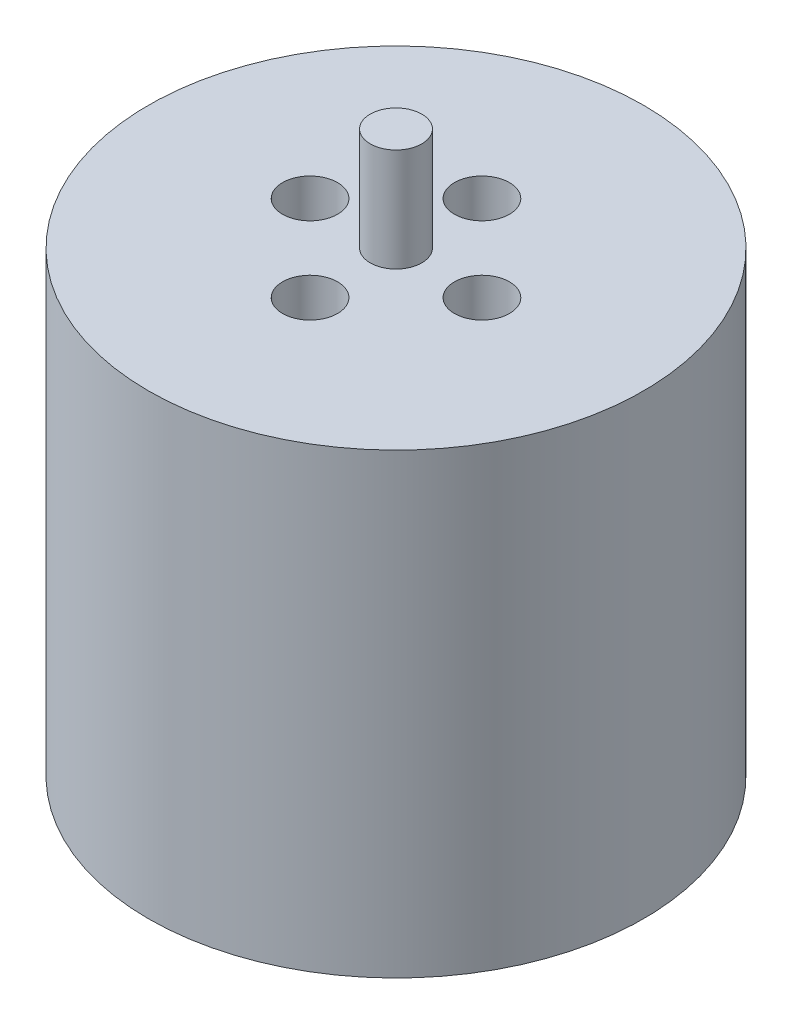
ISO-10303-21;
HEADER;
FILE_DESCRIPTION(('STEP AP214'),'2;1');
FILE_NAME('part.step','',(''),(''),'','','');
FILE_SCHEMA(('AUTOMOTIVE_DESIGN { 1 0 10303 214 1 1 1 1 }'));
ENDSEC;
DATA;
#1=APPLICATION_CONTEXT('core data for automotive mechanical design processes');
#2=APPLICATION_PROTOCOL_DEFINITION('international standard','automotive_design',2000,#1);
#3=PRODUCT_CONTEXT('',#1,'mechanical');
#4=PRODUCT('Part','Part','',(#3));
#5=PRODUCT_RELATED_PRODUCT_CATEGORY('part','',(#4));
#6=PRODUCT_DEFINITION_FORMATION('','',#4);
#7=PRODUCT_DEFINITION_CONTEXT('part definition',#1,'design');
#8=PRODUCT_DEFINITION('design','',#6,#7);
#9=PRODUCT_DEFINITION_SHAPE('','',#8);
#10=(LENGTH_UNIT() NAMED_UNIT(*) SI_UNIT(.MILLI.,.METRE.));
#11=(NAMED_UNIT(*) PLANE_ANGLE_UNIT() SI_UNIT($,.RADIAN.));
#12=(NAMED_UNIT(*) SI_UNIT($,.STERADIAN.) SOLID_ANGLE_UNIT());
#13=UNCERTAINTY_MEASURE_WITH_UNIT(LENGTH_MEASURE(1.E-05),#10,'distance_accuracy_value','');
#14=(GEOMETRIC_REPRESENTATION_CONTEXT(3) GLOBAL_UNCERTAINTY_ASSIGNED_CONTEXT((#13)) GLOBAL_UNIT_ASSIGNED_CONTEXT((#10,
#11,#12)) REPRESENTATION_CONTEXT('',''));
#15=CARTESIAN_POINT('',(0.,0.,0.));
#16=DIRECTION('',(0.,0.,1.));
#17=DIRECTION('',(1.,0.,0.));
#18=AXIS2_PLACEMENT_3D('',#15,#16,#17);
#19=CARTESIAN_POINT('',(0.,6.65,0.));
#20=DIRECTION('',(0.,-1.,0.));
#21=DIRECTION('',(0.,0.,-1.));
#22=AXIS2_PLACEMENT_3D('',#19,#20,#21);
#23=CYLINDRICAL_SURFACE('',#22,7.2);
#24=CARTESIAN_POINT('',(0.,6.65,0.));
#25=DIRECTION('',(0.,1.,0.));
#26=DIRECTION('',(0.,0.,1.));
#27=AXIS2_PLACEMENT_3D('',#24,#25,#26);
#28=CIRCLE('',#27,7.2);
#29=CARTESIAN_POINT('',(0.,6.65,7.2));
#30=VERTEX_POINT('',#29);
#31=EDGE_CURVE('E37',#30,#30,#28,.T.);
#32=ORIENTED_EDGE('',*,*,#31,.F.);
#33=EDGE_LOOP('',(#32));
#34=FACE_BOUND('',#33,.T.);
#35=CARTESIAN_POINT('',(0.,-6.65,0.));
#36=DIRECTION('',(0.,1.,0.));
#37=DIRECTION('',(0.,0.,1.));
#38=AXIS2_PLACEMENT_3D('',#35,#36,#37);
#39=CIRCLE('',#38,7.2);
#40=CARTESIAN_POINT('',(0.,-6.65,7.2));
#41=VERTEX_POINT('',#40);
#42=EDGE_CURVE('E41',#41,#41,#39,.T.);
#43=ORIENTED_EDGE('',*,*,#42,.T.);
#44=EDGE_LOOP('',(#43));
#45=FACE_BOUND('',#44,.T.);
#46=ADVANCED_FACE('F31',(#34,#45),#23,.T.);
#47=CARTESIAN_POINT('',(0.,6.65,0.));
#48=DIRECTION('',(0.,1.,0.));
#49=DIRECTION('',(0.,0.,1.));
#50=AXIS2_PLACEMENT_3D('',#47,#48,#49);
#51=PLANE('',#50);
#52=CARTESIAN_POINT('',(2.5,6.65,0.));
#53=DIRECTION('',(0.,1.,0.));
#54=DIRECTION('',(0.,0.,1.));
#55=AXIS2_PLACEMENT_3D('',#52,#53,#54);
#56=CIRCLE('',#55,0.8);
#57=CARTESIAN_POINT('',(2.5,6.65,0.8));
#58=VERTEX_POINT('',#57);
#59=EDGE_CURVE('E99',#58,#58,#56,.T.);
#60=ORIENTED_EDGE('',*,*,#59,.F.);
#61=EDGE_LOOP('',(#60));
#62=FACE_BOUND('',#61,.T.);
#63=CARTESIAN_POINT('',(0.,6.65,2.5));
#64=DIRECTION('',(0.,1.,0.));
#65=DIRECTION('',(0.,0.,1.));
#66=AXIS2_PLACEMENT_3D('',#63,#64,#65);
#67=CIRCLE('',#66,0.8);
#68=CARTESIAN_POINT('',(0.,6.65,3.3));
#69=VERTEX_POINT('',#68);
#70=EDGE_CURVE('E93',#69,#69,#67,.T.);
#71=ORIENTED_EDGE('',*,*,#70,.F.);
#72=EDGE_LOOP('',(#71));
#73=FACE_BOUND('',#72,.T.);
#74=CARTESIAN_POINT('',(-2.5,6.65,0.));
#75=DIRECTION('',(0.,1.,0.));
#76=DIRECTION('',(0.,0.,1.));
#77=AXIS2_PLACEMENT_3D('',#74,#75,#76);
#78=CIRCLE('',#77,0.8);
#79=CARTESIAN_POINT('',(-2.5,6.65,0.8));
#80=VERTEX_POINT('',#79);
#81=EDGE_CURVE('E87',#80,#80,#78,.T.);
#82=ORIENTED_EDGE('',*,*,#81,.F.);
#83=EDGE_LOOP('',(#82));
#84=FACE_BOUND('',#83,.T.);
#85=CARTESIAN_POINT('',(0.,6.65,-2.5));
#86=DIRECTION('',(0.,1.,0.));
#87=DIRECTION('',(0.,0.,1.));
#88=AXIS2_PLACEMENT_3D('',#85,#86,#87);
#89=CIRCLE('',#88,0.8);
#90=CARTESIAN_POINT('',(0.,6.65,-1.7));
#91=VERTEX_POINT('',#90);
#92=EDGE_CURVE('E81',#91,#91,#89,.T.);
#93=ORIENTED_EDGE('',*,*,#92,.F.);
#94=EDGE_LOOP('',(#93));
#95=FACE_BOUND('',#94,.T.);
#96=CARTESIAN_POINT('',(0.,6.65,0.));
#97=DIRECTION('',(0.,1.,0.));
#98=DIRECTION('',(0.,0.,1.));
#99=AXIS2_PLACEMENT_3D('',#96,#97,#98);
#100=CIRCLE('',#99,0.75);
#101=CARTESIAN_POINT('',(0.,6.65,0.75));
#102=VERTEX_POINT('',#101);
#103=EDGE_CURVE('E51',#102,#102,#100,.T.);
#104=ORIENTED_EDGE('',*,*,#103,.F.);
#105=EDGE_LOOP('',(#104));
#106=FACE_BOUND('',#105,.T.);
#107=ORIENTED_EDGE('',*,*,#31,.T.);
#108=EDGE_LOOP('',(#107));
#109=FACE_BOUND('',#108,.T.);
#110=ADVANCED_FACE('F114',(#62,#73,#84,#95,#106,#109),#51,.T.);
#111=CARTESIAN_POINT('',(0.,-6.65,0.));
#112=DIRECTION('',(0.,1.,0.));
#113=DIRECTION('',(0.,0.,1.));
#114=AXIS2_PLACEMENT_3D('',#111,#112,#113);
#115=PLANE('',#114);
#116=CARTESIAN_POINT('',(0.,-6.65,4.5));
#117=DIRECTION('',(0.,-1.,0.));
#118=DIRECTION('',(0.,0.,-1.));
#119=AXIS2_PLACEMENT_3D('',#116,#117,#118);
#120=CIRCLE('',#119,0.8);
#121=CARTESIAN_POINT('',(0.,-6.65,3.7));
#122=VERTEX_POINT('',#121);
#123=EDGE_CURVE('E76',#122,#122,#120,.T.);
#124=ORIENTED_EDGE('',*,*,#123,.F.);
#125=EDGE_LOOP('',(#124));
#126=FACE_BOUND('',#125,.T.);
#127=CARTESIAN_POINT('',(4.5,-6.65,0.));
#128=DIRECTION('',(0.,-1.,0.));
#129=DIRECTION('',(0.,0.,-1.));
#130=AXIS2_PLACEMENT_3D('',#127,#128,#129);
#131=CIRCLE('',#130,0.800000000000001);
#132=CARTESIAN_POINT('',(4.5,-6.65,-0.800000000000001));
#133=VERTEX_POINT('',#132);
#134=EDGE_CURVE('E70',#133,#133,#131,.T.);
#135=ORIENTED_EDGE('',*,*,#134,.F.);
#136=EDGE_LOOP('',(#135));
#137=FACE_BOUND('',#136,.T.);
#138=CARTESIAN_POINT('',(0.,-6.65,-4.5));
#139=DIRECTION('',(0.,-1.,0.));
#140=DIRECTION('',(0.,0.,-1.));
#141=AXIS2_PLACEMENT_3D('',#138,#139,#140);
#142=CIRCLE('',#141,0.8);
#143=CARTESIAN_POINT('',(0.,-6.65,-5.3));
#144=VERTEX_POINT('',#143);
#145=EDGE_CURVE('E64',#144,#144,#142,.T.);
#146=ORIENTED_EDGE('',*,*,#145,.F.);
#147=EDGE_LOOP('',(#146));
#148=FACE_BOUND('',#147,.T.);
#149=CARTESIAN_POINT('',(-4.5,-6.65,0.));
#150=DIRECTION('',(0.,-1.,0.));
#151=DIRECTION('',(0.,0.,-1.));
#152=AXIS2_PLACEMENT_3D('',#149,#150,#151);
#153=CIRCLE('',#152,0.8);
#154=CARTESIAN_POINT('',(-4.5,-6.65,-0.8));
#155=VERTEX_POINT('',#154);
#156=EDGE_CURVE('E57',#155,#155,#153,.T.);
#157=ORIENTED_EDGE('',*,*,#156,.F.);
#158=EDGE_LOOP('',(#157));
#159=FACE_BOUND('',#158,.T.);
#160=CARTESIAN_POINT('',(0.,-6.65,0.));
#161=DIRECTION('',(0.,1.,0.));
#162=DIRECTION('',(0.,0.,1.));
#163=AXIS2_PLACEMENT_3D('',#160,#161,#162);
#164=CIRCLE('',#163,0.75);
#165=CARTESIAN_POINT('',(0.,-6.65,0.75));
#166=VERTEX_POINT('',#165);
#167=EDGE_CURVE('E10',#166,#166,#164,.F.);
#168=ORIENTED_EDGE('',*,*,#167,.F.);
#169=EDGE_LOOP('',(#168));
#170=FACE_BOUND('',#169,.T.);
#171=ORIENTED_EDGE('',*,*,#42,.F.);
#172=EDGE_LOOP('',(#171));
#173=FACE_BOUND('',#172,.T.);
#174=ADVANCED_FACE('F117',(#126,#137,#148,#159,#170,#173),#115,.F.);
#175=CARTESIAN_POINT('',(0.,-7.65,0.));
#176=DIRECTION('',(0.,1.,0.));
#177=DIRECTION('',(0.,0.,1.));
#178=AXIS2_PLACEMENT_3D('',#175,#176,#177);
#179=CYLINDRICAL_SURFACE('',#178,0.75);
#180=CARTESIAN_POINT('',(0.,-7.65,0.));
#181=DIRECTION('',(0.,-1.,0.));
#182=DIRECTION('',(0.,0.,-1.));
#183=AXIS2_PLACEMENT_3D('',#180,#181,#182);
#184=CIRCLE('',#183,0.75);
#185=CARTESIAN_POINT('',(0.,-7.65,-0.75));
#186=VERTEX_POINT('',#185);
#187=EDGE_CURVE('E46',#186,#186,#184,.T.);
#188=ORIENTED_EDGE('',*,*,#187,.F.);
#189=EDGE_LOOP('',(#188));
#190=FACE_BOUND('',#189,.T.);
#191=ORIENTED_EDGE('',*,*,#167,.T.);
#192=EDGE_LOOP('',(#191));
#193=FACE_BOUND('',#192,.T.);
#194=ADVANCED_FACE('F140',(#190,#193),#179,.T.);
#195=CARTESIAN_POINT('',(0.,-7.65,0.));
#196=DIRECTION('',(0.,-1.,0.));
#197=DIRECTION('',(0.,0.,-1.));
#198=AXIS2_PLACEMENT_3D('',#195,#196,#197);
#199=PLANE('',#198);
#200=ORIENTED_EDGE('',*,*,#187,.T.);
#201=EDGE_LOOP('',(#200));
#202=FACE_BOUND('',#201,.T.);
#203=ADVANCED_FACE('F130',(#202),#199,.T.);
#204=CARTESIAN_POINT('',(0.,9.65,0.));
#205=DIRECTION('',(0.,-1.,0.));
#206=DIRECTION('',(0.,0.,-1.));
#207=AXIS2_PLACEMENT_3D('',#204,#205,#206);
#208=CYLINDRICAL_SURFACE('',#207,0.75);
#209=CARTESIAN_POINT('',(0.,9.65,0.));
#210=DIRECTION('',(0.,1.,0.));
#211=DIRECTION('',(0.,0.,1.));
#212=AXIS2_PLACEMENT_3D('',#209,#210,#211);
#213=CIRCLE('',#212,0.75);
#214=CARTESIAN_POINT('',(0.,9.65,0.75));
#215=VERTEX_POINT('',#214);
#216=EDGE_CURVE('E50',#215,#215,#213,.T.);
#217=ORIENTED_EDGE('',*,*,#216,.F.);
#218=EDGE_LOOP('',(#217));
#219=FACE_BOUND('',#218,.T.);
#220=ORIENTED_EDGE('',*,*,#103,.T.);
#221=EDGE_LOOP('',(#220));
#222=FACE_BOUND('',#221,.T.);
#223=ADVANCED_FACE('F127',(#219,#222),#208,.T.);
#224=CARTESIAN_POINT('',(0.,9.65,0.));
#225=DIRECTION('',(0.,1.,0.));
#226=DIRECTION('',(0.,0.,1.));
#227=AXIS2_PLACEMENT_3D('',#224,#225,#226);
#228=PLANE('',#227);
#229=ORIENTED_EDGE('',*,*,#216,.T.);
#230=EDGE_LOOP('',(#229));
#231=FACE_BOUND('',#230,.T.);
#232=ADVANCED_FACE('F129',(#231),#228,.T.);
#233=CARTESIAN_POINT('',(-4.5,-4.65,0.));
#234=DIRECTION('',(0.,-1.,0.));
#235=DIRECTION('',(0.,0.,-1.));
#236=AXIS2_PLACEMENT_3D('',#233,#234,#235);
#237=CYLINDRICAL_SURFACE('',#236,0.8);
#238=CARTESIAN_POINT('',(-4.5,-4.65,0.));
#239=DIRECTION('',(0.,-1.,0.));
#240=DIRECTION('',(0.,0.,-1.));
#241=AXIS2_PLACEMENT_3D('',#238,#239,#240);
#242=CIRCLE('',#241,0.8);
#243=CARTESIAN_POINT('',(-4.5,-4.65,-0.8));
#244=VERTEX_POINT('',#243);
#245=EDGE_CURVE('E60',#244,#244,#242,.T.);
#246=ORIENTED_EDGE('',*,*,#245,.F.);
#247=EDGE_LOOP('',(#246));
#248=FACE_BOUND('',#247,.T.);
#249=ORIENTED_EDGE('',*,*,#156,.T.);
#250=EDGE_LOOP('',(#249));
#251=FACE_BOUND('',#250,.T.);
#252=ADVANCED_FACE('F137',(#248,#251),#237,.F.);
#253=CARTESIAN_POINT('',(-4.5,-4.65,0.));
#254=DIRECTION('',(0.,-1.,0.));
#255=DIRECTION('',(0.,0.,-1.));
#256=AXIS2_PLACEMENT_3D('',#253,#254,#255);
#257=PLANE('',#256);
#258=ORIENTED_EDGE('',*,*,#245,.T.);
#259=EDGE_LOOP('',(#258));
#260=FACE_BOUND('',#259,.T.);
#261=ADVANCED_FACE('F168',(#260),#257,.T.);
#262=CARTESIAN_POINT('',(0.,-4.65,-4.5));
#263=DIRECTION('',(0.,-1.,0.));
#264=DIRECTION('',(0.,0.,-1.));
#265=AXIS2_PLACEMENT_3D('',#262,#263,#264);
#266=CYLINDRICAL_SURFACE('',#265,0.8);
#267=CARTESIAN_POINT('',(0.,-4.65,-4.5));
#268=DIRECTION('',(0.,-1.,0.));
#269=DIRECTION('',(0.,0.,-1.));
#270=AXIS2_PLACEMENT_3D('',#267,#268,#269);
#271=CIRCLE('',#270,0.8);
#272=CARTESIAN_POINT('',(0.,-4.65,-5.3));
#273=VERTEX_POINT('',#272);
#274=EDGE_CURVE('E67',#273,#273,#271,.T.);
#275=ORIENTED_EDGE('',*,*,#274,.F.);
#276=EDGE_LOOP('',(#275));
#277=FACE_BOUND('',#276,.T.);
#278=ORIENTED_EDGE('',*,*,#145,.T.);
#279=EDGE_LOOP('',(#278));
#280=FACE_BOUND('',#279,.T.);
#281=ADVANCED_FACE('F174',(#277,#280),#266,.F.);
#282=CARTESIAN_POINT('',(0.,-4.65,-4.5));
#283=DIRECTION('',(0.,-1.,0.));
#284=DIRECTION('',(0.,0.,-1.));
#285=AXIS2_PLACEMENT_3D('',#282,#283,#284);
#286=PLANE('',#285);
#287=ORIENTED_EDGE('',*,*,#274,.T.);
#288=EDGE_LOOP('',(#287));
#289=FACE_BOUND('',#288,.T.);
#290=ADVANCED_FACE('F181',(#289),#286,.T.);
#291=CARTESIAN_POINT('',(4.5,-4.65,0.));
#292=DIRECTION('',(0.,-1.,0.));
#293=DIRECTION('',(0.,0.,-1.));
#294=AXIS2_PLACEMENT_3D('',#291,#292,#293);
#295=CYLINDRICAL_SURFACE('',#294,0.800000000000001);
#296=CARTESIAN_POINT('',(4.5,-4.65,0.));
#297=DIRECTION('',(0.,-1.,0.));
#298=DIRECTION('',(0.,0.,-1.));
#299=AXIS2_PLACEMENT_3D('',#296,#297,#298);
#300=CIRCLE('',#299,0.800000000000001);
#301=CARTESIAN_POINT('',(4.5,-4.65,-0.800000000000001));
#302=VERTEX_POINT('',#301);
#303=EDGE_CURVE('E73',#302,#302,#300,.T.);
#304=ORIENTED_EDGE('',*,*,#303,.F.);
#305=EDGE_LOOP('',(#304));
#306=FACE_BOUND('',#305,.T.);
#307=ORIENTED_EDGE('',*,*,#134,.T.);
#308=EDGE_LOOP('',(#307));
#309=FACE_BOUND('',#308,.T.);
#310=ADVANCED_FACE('F185',(#306,#309),#295,.F.);
#311=CARTESIAN_POINT('',(4.5,-4.65,0.));
#312=DIRECTION('',(0.,-1.,0.));
#313=DIRECTION('',(0.,0.,-1.));
#314=AXIS2_PLACEMENT_3D('',#311,#312,#313);
#315=PLANE('',#314);
#316=ORIENTED_EDGE('',*,*,#303,.T.);
#317=EDGE_LOOP('',(#316));
#318=FACE_BOUND('',#317,.T.);
#319=ADVANCED_FACE('F189',(#318),#315,.T.);
#320=CARTESIAN_POINT('',(0.,-4.65,4.5));
#321=DIRECTION('',(0.,-1.,0.));
#322=DIRECTION('',(0.,0.,-1.));
#323=AXIS2_PLACEMENT_3D('',#320,#321,#322);
#324=CYLINDRICAL_SURFACE('',#323,0.8);
#325=CARTESIAN_POINT('',(0.,-4.65,4.5));
#326=DIRECTION('',(0.,-1.,0.));
#327=DIRECTION('',(0.,0.,-1.));
#328=AXIS2_PLACEMENT_3D('',#325,#326,#327);
#329=CIRCLE('',#328,0.8);
#330=CARTESIAN_POINT('',(0.,-4.65,3.7));
#331=VERTEX_POINT('',#330);
#332=EDGE_CURVE('E54',#331,#331,#329,.T.);
#333=ORIENTED_EDGE('',*,*,#332,.F.);
#334=EDGE_LOOP('',(#333));
#335=FACE_BOUND('',#334,.T.);
#336=ORIENTED_EDGE('',*,*,#123,.T.);
#337=EDGE_LOOP('',(#336));
#338=FACE_BOUND('',#337,.T.);
#339=ADVANCED_FACE('F193',(#335,#338),#324,.F.);
#340=CARTESIAN_POINT('',(0.,-4.65,4.5));
#341=DIRECTION('',(0.,-1.,0.));
#342=DIRECTION('',(0.,0.,-1.));
#343=AXIS2_PLACEMENT_3D('',#340,#341,#342);
#344=PLANE('',#343);
#345=ORIENTED_EDGE('',*,*,#332,.T.);
#346=EDGE_LOOP('',(#345));
#347=FACE_BOUND('',#346,.T.);
#348=ADVANCED_FACE('F197',(#347),#344,.T.);
#349=CARTESIAN_POINT('',(0.,4.65,-2.5));
#350=DIRECTION('',(0.,1.,0.));
#351=DIRECTION('',(0.,0.,1.));
#352=AXIS2_PLACEMENT_3D('',#349,#350,#351);
#353=CYLINDRICAL_SURFACE('',#352,0.8);
#354=CARTESIAN_POINT('',(0.,4.65,-2.5));
#355=DIRECTION('',(0.,1.,0.));
#356=DIRECTION('',(0.,0.,1.));
#357=AXIS2_PLACEMENT_3D('',#354,#355,#356);
#358=CIRCLE('',#357,0.8);
#359=CARTESIAN_POINT('',(0.,4.65,-1.7));
#360=VERTEX_POINT('',#359);
#361=EDGE_CURVE('E84',#360,#360,#358,.T.);
#362=ORIENTED_EDGE('',*,*,#361,.F.);
#363=EDGE_LOOP('',(#362));
#364=FACE_BOUND('',#363,.T.);
#365=ORIENTED_EDGE('',*,*,#92,.T.);
#366=EDGE_LOOP('',(#365));
#367=FACE_BOUND('',#366,.T.);
#368=ADVANCED_FACE('F201',(#364,#367),#353,.F.);
#369=CARTESIAN_POINT('',(0.,4.65,-2.5));
#370=DIRECTION('',(0.,1.,0.));
#371=DIRECTION('',(0.,0.,1.));
#372=AXIS2_PLACEMENT_3D('',#369,#370,#371);
#373=PLANE('',#372);
#374=ORIENTED_EDGE('',*,*,#361,.T.);
#375=EDGE_LOOP('',(#374));
#376=FACE_BOUND('',#375,.T.);
#377=ADVANCED_FACE('F205',(#376),#373,.T.);
#378=CARTESIAN_POINT('',(-2.5,4.65,0.));
#379=DIRECTION('',(0.,1.,0.));
#380=DIRECTION('',(0.,0.,1.));
#381=AXIS2_PLACEMENT_3D('',#378,#379,#380);
#382=CYLINDRICAL_SURFACE('',#381,0.8);
#383=CARTESIAN_POINT('',(-2.5,4.65,0.));
#384=DIRECTION('',(0.,1.,0.));
#385=DIRECTION('',(0.,0.,1.));
#386=AXIS2_PLACEMENT_3D('',#383,#384,#385);
#387=CIRCLE('',#386,0.8);
#388=CARTESIAN_POINT('',(-2.5,4.65,0.8));
#389=VERTEX_POINT('',#388);
#390=EDGE_CURVE('E90',#389,#389,#387,.T.);
#391=ORIENTED_EDGE('',*,*,#390,.F.);
#392=EDGE_LOOP('',(#391));
#393=FACE_BOUND('',#392,.T.);
#394=ORIENTED_EDGE('',*,*,#81,.T.);
#395=EDGE_LOOP('',(#394));
#396=FACE_BOUND('',#395,.T.);
#397=ADVANCED_FACE('F209',(#393,#396),#382,.F.);
#398=CARTESIAN_POINT('',(-2.5,4.65,0.));
#399=DIRECTION('',(0.,1.,0.));
#400=DIRECTION('',(0.,0.,1.));
#401=AXIS2_PLACEMENT_3D('',#398,#399,#400);
#402=PLANE('',#401);
#403=ORIENTED_EDGE('',*,*,#390,.T.);
#404=EDGE_LOOP('',(#403));
#405=FACE_BOUND('',#404,.T.);
#406=ADVANCED_FACE('F213',(#405),#402,.T.);
#407=CARTESIAN_POINT('',(0.,4.65,2.5));
#408=DIRECTION('',(0.,1.,0.));
#409=DIRECTION('',(0.,0.,1.));
#410=AXIS2_PLACEMENT_3D('',#407,#408,#409);
#411=CYLINDRICAL_SURFACE('',#410,0.8);
#412=CARTESIAN_POINT('',(0.,4.65,2.5));
#413=DIRECTION('',(0.,1.,0.));
#414=DIRECTION('',(0.,0.,1.));
#415=AXIS2_PLACEMENT_3D('',#412,#413,#414);
#416=CIRCLE('',#415,0.8);
#417=CARTESIAN_POINT('',(0.,4.65,3.3));
#418=VERTEX_POINT('',#417);
#419=EDGE_CURVE('E96',#418,#418,#416,.T.);
#420=ORIENTED_EDGE('',*,*,#419,.F.);
#421=EDGE_LOOP('',(#420));
#422=FACE_BOUND('',#421,.T.);
#423=ORIENTED_EDGE('',*,*,#70,.T.);
#424=EDGE_LOOP('',(#423));
#425=FACE_BOUND('',#424,.T.);
#426=ADVANCED_FACE('F217',(#422,#425),#411,.F.);
#427=CARTESIAN_POINT('',(0.,4.65,2.5));
#428=DIRECTION('',(0.,1.,0.));
#429=DIRECTION('',(0.,0.,1.));
#430=AXIS2_PLACEMENT_3D('',#427,#428,#429);
#431=PLANE('',#430);
#432=ORIENTED_EDGE('',*,*,#419,.T.);
#433=EDGE_LOOP('',(#432));
#434=FACE_BOUND('',#433,.T.);
#435=ADVANCED_FACE('F110',(#434),#431,.T.);
#436=CARTESIAN_POINT('',(2.5,4.65,0.));
#437=DIRECTION('',(0.,1.,0.));
#438=DIRECTION('',(0.,0.,1.));
#439=AXIS2_PLACEMENT_3D('',#436,#437,#438);
#440=CYLINDRICAL_SURFACE('',#439,0.8);
#441=CARTESIAN_POINT('',(2.5,4.65,0.));
#442=DIRECTION('',(0.,1.,0.));
#443=DIRECTION('',(0.,0.,1.));
#444=AXIS2_PLACEMENT_3D('',#441,#442,#443);
#445=CIRCLE('',#444,0.8);
#446=CARTESIAN_POINT('',(2.5,4.65,0.8));
#447=VERTEX_POINT('',#446);
#448=EDGE_CURVE('E61',#447,#447,#445,.T.);
#449=ORIENTED_EDGE('',*,*,#448,.F.);
#450=EDGE_LOOP('',(#449));
#451=FACE_BOUND('',#450,.T.);
#452=ORIENTED_EDGE('',*,*,#59,.T.);
#453=EDGE_LOOP('',(#452));
#454=FACE_BOUND('',#453,.T.);
#455=ADVANCED_FACE('F107',(#451,#454),#440,.F.);
#456=CARTESIAN_POINT('',(2.5,4.65,0.));
#457=DIRECTION('',(0.,1.,0.));
#458=DIRECTION('',(0.,0.,1.));
#459=AXIS2_PLACEMENT_3D('',#456,#457,#458);
#460=PLANE('',#459);
#461=ORIENTED_EDGE('',*,*,#448,.T.);
#462=EDGE_LOOP('',(#461));
#463=FACE_BOUND('',#462,.T.);
#464=ADVANCED_FACE('F105',(#463),#460,.T.);
#465=CLOSED_SHELL('',(#46,#110,#174,#194,#203,#223,#232,#252,#261,#281,#290,#310,#319,#339,#348,
#368,#377,#397,#406,#426,#435,#455,#464));
#466=MANIFOLD_SOLID_BREP('B2',#465);
#467=ADVANCED_BREP_SHAPE_REPRESENTATION('',(#18,#466),#14);
#468=SHAPE_DEFINITION_REPRESENTATION(#9,#467);
ENDSEC;
END-ISO-10303-21;
